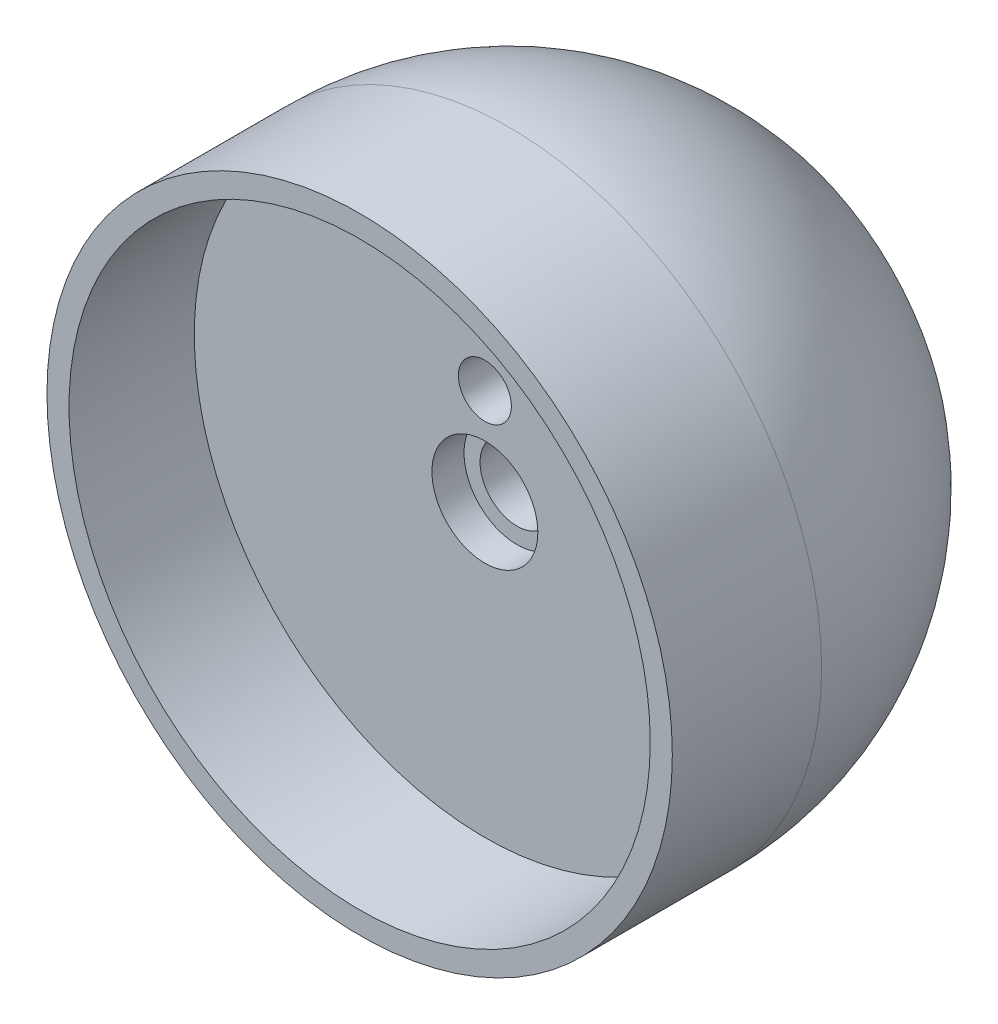
ISO-10303-21;
HEADER;
FILE_DESCRIPTION(('STEP AP214'),'2;1');
FILE_NAME('part.step','',(''),(''),'','','');
FILE_SCHEMA(('AUTOMOTIVE_DESIGN { 1 0 10303 214 1 1 1 1 }'));
ENDSEC;
DATA;
#1=APPLICATION_CONTEXT('core data for automotive mechanical design processes');
#2=APPLICATION_PROTOCOL_DEFINITION('international standard','automotive_design',2000,#1);
#3=PRODUCT_CONTEXT('',#1,'mechanical');
#4=PRODUCT('Part','Part','',(#3));
#5=PRODUCT_RELATED_PRODUCT_CATEGORY('part','',(#4));
#6=PRODUCT_DEFINITION_FORMATION('','',#4);
#7=PRODUCT_DEFINITION_CONTEXT('part definition',#1,'design');
#8=PRODUCT_DEFINITION('design','',#6,#7);
#9=PRODUCT_DEFINITION_SHAPE('','',#8);
#10=(LENGTH_UNIT() NAMED_UNIT(*) SI_UNIT(.MILLI.,.METRE.));
#11=(NAMED_UNIT(*) PLANE_ANGLE_UNIT() SI_UNIT($,.RADIAN.));
#12=(NAMED_UNIT(*) SI_UNIT($,.STERADIAN.) SOLID_ANGLE_UNIT());
#13=UNCERTAINTY_MEASURE_WITH_UNIT(LENGTH_MEASURE(1.E-05),#10,'distance_accuracy_value','');
#14=(GEOMETRIC_REPRESENTATION_CONTEXT(3) GLOBAL_UNCERTAINTY_ASSIGNED_CONTEXT((#13)) GLOBAL_UNIT_ASSIGNED_CONTEXT((#10,
#11,#12)) REPRESENTATION_CONTEXT('',''));
#15=CARTESIAN_POINT('',(0.,0.,0.));
#16=DIRECTION('',(0.,0.,1.));
#17=DIRECTION('',(1.,0.,0.));
#18=AXIS2_PLACEMENT_3D('',#15,#16,#17);
#19=CARTESIAN_POINT('',(0.,0.,-38.1));
#20=DIRECTION('',(0.,0.,1.));
#21=DIRECTION('',(1.,0.,0.));
#22=AXIS2_PLACEMENT_3D('',#19,#20,#21);
#23=CYLINDRICAL_SURFACE('',#22,5.842);
#24=CARTESIAN_POINT('',(0.,0.,-1.27));
#25=DIRECTION('',(0.,0.,1.));
#26=DIRECTION('',(1.,0.,0.));
#27=AXIS2_PLACEMENT_3D('',#24,#25,#26);
#28=CIRCLE('',#27,5.842);
#29=CARTESIAN_POINT('',(5.842,0.,-1.27));
#30=VERTEX_POINT('',#29);
#31=EDGE_CURVE('E73',#30,#30,#28,.T.);
#32=ORIENTED_EDGE('',*,*,#31,.T.);
#33=EDGE_LOOP('',(#32));
#34=FACE_BOUND('',#33,.T.);
#35=CARTESIAN_POINT('',(0.,0.,-33.02));
#36=DIRECTION('',(0.,0.,-1.));
#37=DIRECTION('',(-1.,0.,0.));
#38=AXIS2_PLACEMENT_3D('',#35,#36,#37);
#39=CIRCLE('',#38,5.842);
#40=CARTESIAN_POINT('',(-5.842,0.,-33.02));
#41=VERTEX_POINT('',#40);
#42=EDGE_CURVE('E41',#41,#41,#39,.F.);
#43=ORIENTED_EDGE('',*,*,#42,.F.);
#44=EDGE_LOOP('',(#43));
#45=FACE_BOUND('',#44,.T.);
#46=ADVANCED_FACE('F37',(#34,#45),#23,.F.);
#47=CARTESIAN_POINT('',(0.,0.,23.622));
#48=DIRECTION('',(0.,0.,-1.));
#49=DIRECTION('',(-1.,0.,0.));
#50=AXIS2_PLACEMENT_3D('',#47,#48,#49);
#51=CYLINDRICAL_SURFACE('',#50,49.4665);
#52=CARTESIAN_POINT('',(0.,0.,23.622));
#53=DIRECTION('',(0.,0.,1.));
#54=DIRECTION('',(1.,0.,0.));
#55=AXIS2_PLACEMENT_3D('',#52,#53,#54);
#56=CIRCLE('',#55,49.4665);
#57=CARTESIAN_POINT('',(49.4665,0.,23.622));
#58=VERTEX_POINT('',#57);
#59=EDGE_CURVE('E10',#58,#58,#56,.T.);
#60=ORIENTED_EDGE('',*,*,#59,.F.);
#61=EDGE_LOOP('',(#60));
#62=FACE_BOUND('',#61,.T.);
#63=CARTESIAN_POINT('',(0.,0.,0.));
#64=DIRECTION('',(0.,0.,1.));
#65=DIRECTION('',(1.,0.,0.));
#66=AXIS2_PLACEMENT_3D('',#63,#64,#65);
#67=CIRCLE('',#66,49.4665);
#68=CARTESIAN_POINT('',(49.4665,0.,0.));
#69=VERTEX_POINT('',#68);
#70=EDGE_CURVE('E58',#69,#69,#67,.T.);
#71=ORIENTED_EDGE('',*,*,#70,.T.);
#72=EDGE_LOOP('',(#71));
#73=FACE_BOUND('',#72,.T.);
#74=ADVANCED_FACE('F39',(#62,#73),#51,.T.);
#75=CARTESIAN_POINT('',(0.,0.,23.622));
#76=DIRECTION('',(0.,0.,1.));
#77=DIRECTION('',(1.,0.,0.));
#78=AXIS2_PLACEMENT_3D('',#75,#76,#77);
#79=PLANE('',#78);
#80=CARTESIAN_POINT('',(0.,0.,23.622));
#81=DIRECTION('',(0.,0.,1.));
#82=DIRECTION('',(1.,0.,0.));
#83=AXIS2_PLACEMENT_3D('',#80,#81,#82);
#84=CIRCLE('',#83,45.974);
#85=CARTESIAN_POINT('',(45.974,0.,23.622));
#86=VERTEX_POINT('',#85);
#87=EDGE_CURVE('E52',#86,#86,#84,.T.);
#88=ORIENTED_EDGE('',*,*,#87,.F.);
#89=EDGE_LOOP('',(#88));
#90=FACE_BOUND('',#89,.T.);
#91=ORIENTED_EDGE('',*,*,#59,.T.);
#92=EDGE_LOOP('',(#91));
#93=FACE_BOUND('',#92,.T.);
#94=ADVANCED_FACE('F108',(#90,#93),#79,.T.);
#95=CARTESIAN_POINT('',(0.,0.,3.81));
#96=DIRECTION('',(0.,0.,1.));
#97=DIRECTION('',(1.,0.,0.));
#98=AXIS2_PLACEMENT_3D('',#95,#96,#97);
#99=CYLINDRICAL_SURFACE('',#98,45.974);
#100=CARTESIAN_POINT('',(0.,0.,3.81));
#101=DIRECTION('',(0.,0.,1.));
#102=DIRECTION('',(1.,0.,0.));
#103=AXIS2_PLACEMENT_3D('',#100,#101,#102);
#104=CIRCLE('',#103,45.974);
#105=CARTESIAN_POINT('',(45.974,0.,3.81));
#106=VERTEX_POINT('',#105);
#107=EDGE_CURVE('E46',#106,#106,#104,.T.);
#108=ORIENTED_EDGE('',*,*,#107,.F.);
#109=EDGE_LOOP('',(#108));
#110=FACE_BOUND('',#109,.T.);
#111=ORIENTED_EDGE('',*,*,#87,.T.);
#112=EDGE_LOOP('',(#111));
#113=FACE_BOUND('',#112,.T.);
#114=ADVANCED_FACE('F132',(#110,#113),#99,.F.);
#115=CARTESIAN_POINT('',(0.,0.,3.81));
#116=DIRECTION('',(0.,0.,1.));
#117=DIRECTION('',(1.,0.,0.));
#118=AXIS2_PLACEMENT_3D('',#115,#116,#117);
#119=PLANE('',#118);
#120=CARTESIAN_POINT('',(0.,15.24,3.81));
#121=DIRECTION('',(0.,0.,1.));
#122=DIRECTION('',(1.,0.,0.));
#123=AXIS2_PLACEMENT_3D('',#120,#121,#122);
#124=CIRCLE('',#123,4.191);
#125=CARTESIAN_POINT('',(4.191,15.24,3.81));
#126=VERTEX_POINT('',#125);
#127=EDGE_CURVE('E80',#126,#126,#124,.T.);
#128=ORIENTED_EDGE('',*,*,#127,.F.);
#129=EDGE_LOOP('',(#128));
#130=FACE_BOUND('',#129,.T.);
#131=CARTESIAN_POINT('',(0.,0.,3.81));
#132=DIRECTION('',(0.,0.,1.));
#133=DIRECTION('',(1.,0.,0.));
#134=AXIS2_PLACEMENT_3D('',#131,#132,#133);
#135=CIRCLE('',#134,8.382);
#136=CARTESIAN_POINT('',(8.382,0.,3.81));
#137=VERTEX_POINT('',#136);
#138=EDGE_CURVE('E67',#137,#137,#135,.T.);
#139=ORIENTED_EDGE('',*,*,#138,.F.);
#140=EDGE_LOOP('',(#139));
#141=FACE_BOUND('',#140,.T.);
#142=ORIENTED_EDGE('',*,*,#107,.T.);
#143=EDGE_LOOP('',(#142));
#144=FACE_BOUND('',#143,.T.);
#145=ADVANCED_FACE('F129',(#130,#141,#144),#119,.T.);
#146=CARTESIAN_POINT('',(0.,0.,0.));
#147=DIRECTION('',(0.,0.,1.));
#148=DIRECTION('',(1.,0.,0.));
#149=AXIS2_PLACEMENT_3D('',#146,#147,#148);
#150=SPHERICAL_SURFACE('',#149,49.4665);
#151=CARTESIAN_POINT('',(0.,0.,-38.1));
#152=DIRECTION('',(0.,0.,1.));
#153=DIRECTION('',(1.,0.,0.));
#154=AXIS2_PLACEMENT_3D('',#151,#152,#153);
#155=CIRCLE('',#154,31.5487657801379);
#156=CARTESIAN_POINT('',(31.5487657801379,0.,-38.1));
#157=VERTEX_POINT('',#156);
#158=EDGE_CURVE('E55',#157,#157,#155,.T.);
#159=ORIENTED_EDGE('',*,*,#158,.T.);
#160=EDGE_LOOP('',(#159));
#161=FACE_BOUND('',#160,.T.);
#162=ORIENTED_EDGE('',*,*,#70,.F.);
#163=EDGE_LOOP('',(#162));
#164=FACE_BOUND('',#163,.T.);
#165=ADVANCED_FACE('F125',(#161,#164),#150,.T.);
#166=CARTESIAN_POINT('',(44.6512342198621,-49.4665,-38.1));
#167=DIRECTION('',(0.,0.,1.));
#168=DIRECTION('',(1.,0.,0.));
#169=AXIS2_PLACEMENT_3D('',#166,#167,#168);
#170=PLANE('',#169);
#171=CARTESIAN_POINT('',(0.,0.,-38.1));
#172=DIRECTION('',(0.,0.,1.));
#173=DIRECTION('',(1.,0.,0.));
#174=AXIS2_PLACEMENT_3D('',#171,#172,#173);
#175=CIRCLE('',#174,8.382);
#176=CARTESIAN_POINT('',(8.382,0.,-38.1));
#177=VERTEX_POINT('',#176);
#178=EDGE_CURVE('E87',#177,#177,#175,.T.);
#179=ORIENTED_EDGE('',*,*,#178,.T.);
#180=EDGE_LOOP('',(#179));
#181=FACE_BOUND('',#180,.T.);
#182=CARTESIAN_POINT('',(0.,15.24,-38.1));
#183=DIRECTION('',(0.,0.,1.));
#184=DIRECTION('',(1.,0.,0.));
#185=AXIS2_PLACEMENT_3D('',#182,#183,#184);
#186=CIRCLE('',#185,4.191);
#187=CARTESIAN_POINT('',(4.191,15.24,-38.1));
#188=VERTEX_POINT('',#187);
#189=EDGE_CURVE('E79',#188,#188,#186,.T.);
#190=ORIENTED_EDGE('',*,*,#189,.T.);
#191=EDGE_LOOP('',(#190));
#192=FACE_BOUND('',#191,.T.);
#193=ORIENTED_EDGE('',*,*,#158,.F.);
#194=EDGE_LOOP('',(#193));
#195=FACE_BOUND('',#194,.T.);
#196=ADVANCED_FACE('F121',(#181,#192,#195),#170,.F.);
#197=CARTESIAN_POINT('',(0.,0.,-1.27));
#198=DIRECTION('',(0.,0.,1.));
#199=DIRECTION('',(1.,0.,0.));
#200=AXIS2_PLACEMENT_3D('',#197,#198,#199);
#201=CYLINDRICAL_SURFACE('',#200,8.382);
#202=CARTESIAN_POINT('',(0.,0.,-1.27));
#203=DIRECTION('',(0.,0.,1.));
#204=DIRECTION('',(1.,0.,0.));
#205=AXIS2_PLACEMENT_3D('',#202,#203,#204);
#206=CIRCLE('',#205,8.382);
#207=CARTESIAN_POINT('',(8.382,0.,-1.27));
#208=VERTEX_POINT('',#207);
#209=EDGE_CURVE('E59',#208,#208,#206,.T.);
#210=ORIENTED_EDGE('',*,*,#209,.F.);
#211=EDGE_LOOP('',(#210));
#212=FACE_BOUND('',#211,.T.);
#213=ORIENTED_EDGE('',*,*,#138,.T.);
#214=EDGE_LOOP('',(#213));
#215=FACE_BOUND('',#214,.T.);
#216=ADVANCED_FACE('F117',(#212,#215),#201,.F.);
#217=CARTESIAN_POINT('',(0.,0.,-1.27));
#218=DIRECTION('',(0.,0.,1.));
#219=DIRECTION('',(1.,0.,0.));
#220=AXIS2_PLACEMENT_3D('',#217,#218,#219);
#221=PLANE('',#220);
#222=ORIENTED_EDGE('',*,*,#31,.F.);
#223=EDGE_LOOP('',(#222));
#224=FACE_BOUND('',#223,.T.);
#225=ORIENTED_EDGE('',*,*,#209,.T.);
#226=EDGE_LOOP('',(#225));
#227=FACE_BOUND('',#226,.T.);
#228=ADVANCED_FACE('F114',(#224,#227),#221,.T.);
#229=CARTESIAN_POINT('',(0.,15.24,-38.1));
#230=DIRECTION('',(0.,0.,1.));
#231=DIRECTION('',(1.,0.,0.));
#232=AXIS2_PLACEMENT_3D('',#229,#230,#231);
#233=CYLINDRICAL_SURFACE('',#232,4.191);
#234=ORIENTED_EDGE('',*,*,#189,.F.);
#235=EDGE_LOOP('',(#234));
#236=FACE_BOUND('',#235,.T.);
#237=ORIENTED_EDGE('',*,*,#127,.T.);
#238=EDGE_LOOP('',(#237));
#239=FACE_BOUND('',#238,.T.);
#240=ADVANCED_FACE('F112',(#236,#239),#233,.F.);
#241=CARTESIAN_POINT('',(0.,0.,-33.02));
#242=DIRECTION('',(0.,0.,-1.));
#243=DIRECTION('',(1.,0.,0.));
#244=AXIS2_PLACEMENT_3D('',#241,#242,#243);
#245=PLANE('',#244);
#246=CARTESIAN_POINT('',(0.,0.,-33.02));
#247=DIRECTION('',(0.,0.,1.));
#248=DIRECTION('',(1.,0.,0.));
#249=AXIS2_PLACEMENT_3D('',#246,#247,#248);
#250=CIRCLE('',#249,8.382);
#251=CARTESIAN_POINT('',(8.382,0.,-33.02));
#252=VERTEX_POINT('',#251);
#253=EDGE_CURVE('E91',#252,#252,#250,.T.);
#254=ORIENTED_EDGE('',*,*,#253,.F.);
#255=EDGE_LOOP('',(#254));
#256=FACE_BOUND('',#255,.T.);
#257=ORIENTED_EDGE('',*,*,#42,.T.);
#258=EDGE_LOOP('',(#257));
#259=FACE_BOUND('',#258,.T.);
#260=ADVANCED_FACE('F100',(#256,#259),#245,.T.);
#261=CARTESIAN_POINT('',(0.,0.,-33.02));
#262=DIRECTION('',(0.,0.,-1.));
#263=DIRECTION('',(-1.,0.,0.));
#264=AXIS2_PLACEMENT_3D('',#261,#262,#263);
#265=CYLINDRICAL_SURFACE('',#264,8.382);
#266=ORIENTED_EDGE('',*,*,#253,.T.);
#267=EDGE_LOOP('',(#266));
#268=FACE_BOUND('',#267,.T.);
#269=ORIENTED_EDGE('',*,*,#178,.F.);
#270=EDGE_LOOP('',(#269));
#271=FACE_BOUND('',#270,.T.);
#272=ADVANCED_FACE('F182',(#268,#271),#265,.F.);
#273=CLOSED_SHELL('',(#46,#74,#94,#114,#145,#165,#196,#216,#228,#240,#260,#272));
#274=MANIFOLD_SOLID_BREP('B2',#273);
#275=ADVANCED_BREP_SHAPE_REPRESENTATION('',(#18,#274),#14);
#276=SHAPE_DEFINITION_REPRESENTATION(#9,#275);
ENDSEC;
END-ISO-10303-21;
